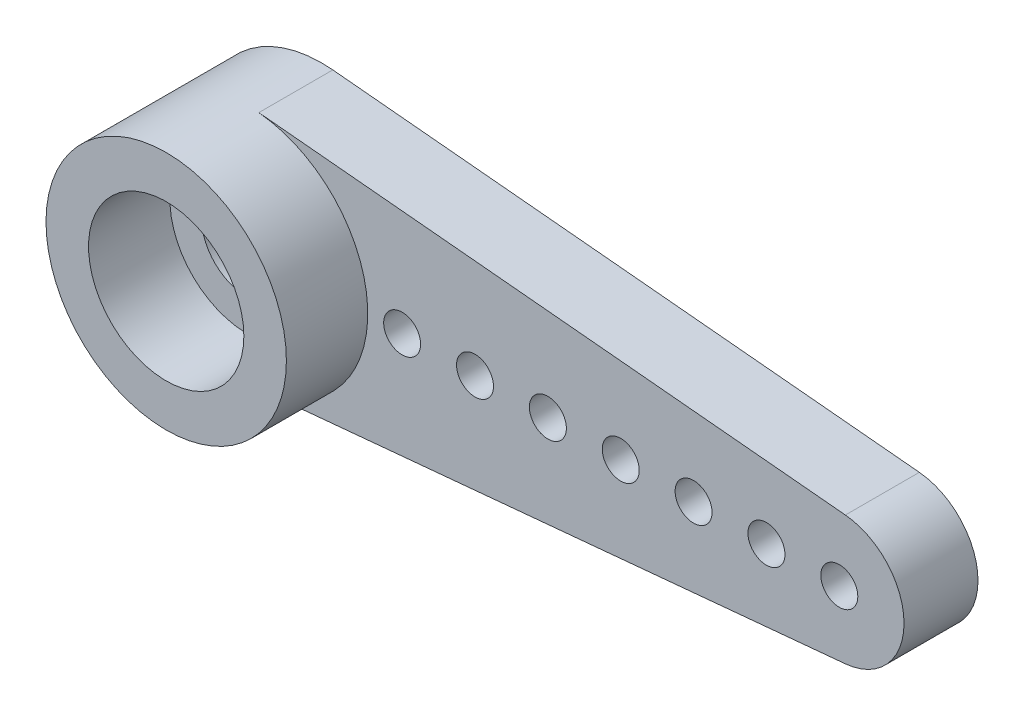
ISO-10303-21;
HEADER;
FILE_DESCRIPTION(('STEP AP214'),'2;1');
FILE_NAME('part.step','',(''),(''),'','','');
FILE_SCHEMA(('AUTOMOTIVE_DESIGN { 1 0 10303 214 1 1 1 1 }'));
ENDSEC;
DATA;
#1=APPLICATION_CONTEXT('core data for automotive mechanical design processes');
#2=APPLICATION_PROTOCOL_DEFINITION('international standard','automotive_design',2000,#1);
#3=PRODUCT_CONTEXT('',#1,'mechanical');
#4=PRODUCT('Part','Part','',(#3));
#5=PRODUCT_RELATED_PRODUCT_CATEGORY('part','',(#4));
#6=PRODUCT_DEFINITION_FORMATION('','',#4);
#7=PRODUCT_DEFINITION_CONTEXT('part definition',#1,'design');
#8=PRODUCT_DEFINITION('design','',#6,#7);
#9=PRODUCT_DEFINITION_SHAPE('','',#8);
#10=(LENGTH_UNIT() NAMED_UNIT(*) SI_UNIT(.MILLI.,.METRE.));
#11=(NAMED_UNIT(*) PLANE_ANGLE_UNIT() SI_UNIT($,.RADIAN.));
#12=(NAMED_UNIT(*) SI_UNIT($,.STERADIAN.) SOLID_ANGLE_UNIT());
#13=UNCERTAINTY_MEASURE_WITH_UNIT(LENGTH_MEASURE(1.E-05),#10,'distance_accuracy_value','');
#14=(GEOMETRIC_REPRESENTATION_CONTEXT(3) GLOBAL_UNCERTAINTY_ASSIGNED_CONTEXT((#13)) GLOBAL_UNIT_ASSIGNED_CONTEXT((#10,
#11,#12)) REPRESENTATION_CONTEXT('',''));
#15=CARTESIAN_POINT('',(0.,0.,0.));
#16=DIRECTION('',(0.,0.,1.));
#17=DIRECTION('',(1.,0.,0.));
#18=AXIS2_PLACEMENT_3D('',#15,#16,#17);
#19=CARTESIAN_POINT('',(16.,0.,2.));
#20=DIRECTION('',(0.,0.,1.));
#21=DIRECTION('',(1.,0.,0.));
#22=AXIS2_PLACEMENT_3D('',#19,#20,#21);
#23=PLANE('',#22);
#24=CARTESIAN_POINT('',(0.,0.,2.));
#25=DIRECTION('',(0.,0.,1.));
#26=DIRECTION('',(1.,0.,0.));
#27=AXIS2_PLACEMENT_3D('',#24,#25,#26);
#28=CIRCLE('',#27,1.25);
#29=CARTESIAN_POINT('',(1.25,0.,2.));
#30=VERTEX_POINT('',#29);
#31=EDGE_CURVE('E118',#30,#30,#28,.T.);
#32=ORIENTED_EDGE('',*,*,#31,.F.);
#33=EDGE_LOOP('',(#32));
#34=FACE_BOUND('',#33,.T.);
#35=CARTESIAN_POINT('',(0.,0.,2.));
#36=DIRECTION('',(0.,0.,1.));
#37=DIRECTION('',(1.,0.,0.));
#38=AXIS2_PLACEMENT_3D('',#35,#36,#37);
#39=CIRCLE('',#38,2.1);
#40=CARTESIAN_POINT('',(2.1,0.,2.));
#41=VERTEX_POINT('',#40);
#42=EDGE_CURVE('E160',#41,#41,#39,.T.);
#43=ORIENTED_EDGE('',*,*,#42,.T.);
#44=EDGE_LOOP('',(#43));
#45=FACE_BOUND('',#44,.T.);
#46=ADVANCED_FACE('F33',(#34,#45),#23,.T.);
#47=CARTESIAN_POINT('',(0.,0.,2.));
#48=DIRECTION('',(0.,0.,1.));
#49=DIRECTION('',(1.,0.,0.));
#50=AXIS2_PLACEMENT_3D('',#47,#48,#49);
#51=CIRCLE('',#50,3.25);
#52=CARTESIAN_POINT('',(0.304687499999997,-3.23568625292128,2.));
#53=VERTEX_POINT('',#52);
#54=CARTESIAN_POINT('',(0.3046875,3.23568625292128,2.));
#55=VERTEX_POINT('',#54);
#56=EDGE_CURVE('E11',#53,#55,#51,.T.);
#57=ORIENTED_EDGE('',*,*,#56,.F.);
#58=DIRECTION('',(0.995595770129625,0.0937499999999999,0.));
#59=VECTOR('',#58,1.);
#60=CARTESIAN_POINT('',(0.3046875,-3.23568625292128,2.));
#61=LINE('',#60,#59);
#62=CARTESIAN_POINT('',(16.1640625,-1.74229259772684,2.));
#63=VERTEX_POINT('',#62);
#64=EDGE_CURVE('E51',#53,#63,#61,.T.);
#65=ORIENTED_EDGE('',*,*,#64,.T.);
#66=CARTESIAN_POINT('',(16.,0.,2.));
#67=DIRECTION('',(0.,0.,1.));
#68=DIRECTION('',(1.,0.,0.));
#69=AXIS2_PLACEMENT_3D('',#66,#67,#68);
#70=CIRCLE('',#69,1.75);
#71=CARTESIAN_POINT('',(16.1640625,1.74229259772684,2.));
#72=VERTEX_POINT('',#71);
#73=EDGE_CURVE('E90',#63,#72,#70,.T.);
#74=ORIENTED_EDGE('',*,*,#73,.T.);
#75=DIRECTION('',(-0.995595770129625,0.09375,0.));
#76=VECTOR('',#75,1.);
#77=CARTESIAN_POINT('',(16.1640625,1.74229259772684,2.));
#78=LINE('',#77,#76);
#79=EDGE_CURVE('E81',#72,#55,#78,.T.);
#80=ORIENTED_EDGE('',*,*,#79,.T.);
#81=EDGE_LOOP('',(#57,#65,#74,#80));
#82=FACE_BOUND('',#81,.T.);
#83=CARTESIAN_POINT('',(6.15,-2.04384822602926E-13,2.));
#84=DIRECTION('',(0.,0.,1.));
#85=DIRECTION('',(1.,0.,0.));
#86=AXIS2_PLACEMENT_3D('',#83,#84,#85);
#87=CIRCLE('',#86,0.499999999999999);
#88=CARTESIAN_POINT('',(6.65,-2.04384822602926E-13,2.));
#89=VERTEX_POINT('',#88);
#90=EDGE_CURVE('E142',#89,#89,#87,.T.);
#91=ORIENTED_EDGE('',*,*,#90,.F.);
#92=EDGE_LOOP('',(#91));
#93=FACE_BOUND('',#92,.T.);
#94=CARTESIAN_POINT('',(10.09,-1.22630893561756E-13,2.));
#95=DIRECTION('',(0.,0.,1.));
#96=DIRECTION('',(1.,0.,0.));
#97=AXIS2_PLACEMENT_3D('',#94,#95,#96);
#98=CIRCLE('',#97,0.499999999999999);
#99=CARTESIAN_POINT('',(10.59,-1.22630893561756E-13,2.));
#100=VERTEX_POINT('',#99);
#101=EDGE_CURVE('E130',#100,#100,#98,.T.);
#102=ORIENTED_EDGE('',*,*,#101,.F.);
#103=EDGE_LOOP('',(#102));
#104=FACE_BOUND('',#103,.T.);
#105=CARTESIAN_POINT('',(16.,0.,2.));
#106=DIRECTION('',(0.,0.,1.));
#107=DIRECTION('',(1.,0.,0.));
#108=AXIS2_PLACEMENT_3D('',#105,#106,#107);
#109=CIRCLE('',#108,0.499999999999999);
#110=CARTESIAN_POINT('',(16.5,0.,2.));
#111=VERTEX_POINT('',#110);
#112=EDGE_CURVE('E105',#111,#111,#109,.T.);
#113=ORIENTED_EDGE('',*,*,#112,.F.);
#114=EDGE_LOOP('',(#113));
#115=FACE_BOUND('',#114,.T.);
#116=CARTESIAN_POINT('',(14.03,0.,2.));
#117=DIRECTION('',(0.,0.,1.));
#118=DIRECTION('',(1.,0.,0.));
#119=AXIS2_PLACEMENT_3D('',#116,#117,#118);
#120=CIRCLE('',#119,0.499999999999999);
#121=CARTESIAN_POINT('',(14.53,0.,2.));
#122=VERTEX_POINT('',#121);
#123=EDGE_CURVE('E112',#122,#122,#120,.T.);
#124=ORIENTED_EDGE('',*,*,#123,.F.);
#125=EDGE_LOOP('',(#124));
#126=FACE_BOUND('',#125,.T.);
#127=CARTESIAN_POINT('',(12.06,0.,2.));
#128=DIRECTION('',(0.,0.,1.));
#129=DIRECTION('',(1.,0.,0.));
#130=AXIS2_PLACEMENT_3D('',#127,#128,#129);
#131=CIRCLE('',#130,0.499999999999999);
#132=CARTESIAN_POINT('',(12.56,0.,2.));
#133=VERTEX_POINT('',#132);
#134=EDGE_CURVE('E124',#133,#133,#131,.T.);
#135=ORIENTED_EDGE('',*,*,#134,.F.);
#136=EDGE_LOOP('',(#135));
#137=FACE_BOUND('',#136,.T.);
#138=CARTESIAN_POINT('',(8.12,-1.63507858082341E-13,2.));
#139=DIRECTION('',(0.,0.,1.));
#140=DIRECTION('',(1.,0.,0.));
#141=AXIS2_PLACEMENT_3D('',#138,#139,#140);
#142=CIRCLE('',#141,0.499999999999999);
#143=CARTESIAN_POINT('',(8.62,-1.63507858082341E-13,2.));
#144=VERTEX_POINT('',#143);
#145=EDGE_CURVE('E136',#144,#144,#142,.T.);
#146=ORIENTED_EDGE('',*,*,#145,.F.);
#147=EDGE_LOOP('',(#146));
#148=FACE_BOUND('',#147,.T.);
#149=CARTESIAN_POINT('',(4.18,-2.45261787123512E-13,2.));
#150=DIRECTION('',(0.,0.,1.));
#151=DIRECTION('',(1.,0.,0.));
#152=AXIS2_PLACEMENT_3D('',#149,#150,#151);
#153=CIRCLE('',#152,0.499999999999999);
#154=CARTESIAN_POINT('',(4.68,-2.45261787123512E-13,2.));
#155=VERTEX_POINT('',#154);
#156=EDGE_CURVE('E148',#155,#155,#153,.T.);
#157=ORIENTED_EDGE('',*,*,#156,.F.);
#158=EDGE_LOOP('',(#157));
#159=FACE_BOUND('',#158,.T.);
#160=ADVANCED_FACE('F87',(#82,#93,#104,#115,#126,#137,#148,#159),#23,.T.);
#161=CARTESIAN_POINT('',(16.,0.,0.));
#162=DIRECTION('',(0.,0.,1.));
#163=DIRECTION('',(1.,0.,0.));
#164=AXIS2_PLACEMENT_3D('',#161,#162,#163);
#165=PLANE('',#164);
#166=CARTESIAN_POINT('',(16.,0.,0.));
#167=DIRECTION('',(0.,0.,1.));
#168=DIRECTION('',(1.,0.,0.));
#169=AXIS2_PLACEMENT_3D('',#166,#167,#168);
#170=CIRCLE('',#169,1.75);
#171=CARTESIAN_POINT('',(16.1640625,-1.74229259772684,0.));
#172=VERTEX_POINT('',#171);
#173=CARTESIAN_POINT('',(16.1640625,1.74229259772684,0.));
#174=VERTEX_POINT('',#173);
#175=EDGE_CURVE('E102',#172,#174,#170,.T.);
#176=ORIENTED_EDGE('',*,*,#175,.F.);
#177=DIRECTION('',(0.995595770129625,0.0937499999999999,0.));
#178=VECTOR('',#177,1.);
#179=CARTESIAN_POINT('',(0.3046875,-3.23568625292128,0.));
#180=LINE('',#179,#178);
#181=CARTESIAN_POINT('',(0.304687499999997,-3.23568625292128,0.));
#182=VERTEX_POINT('',#181);
#183=EDGE_CURVE('E74',#182,#172,#180,.T.);
#184=ORIENTED_EDGE('',*,*,#183,.F.);
#185=CARTESIAN_POINT('',(0.,0.,0.));
#186=DIRECTION('',(0.,0.,1.));
#187=DIRECTION('',(1.,0.,0.));
#188=AXIS2_PLACEMENT_3D('',#185,#186,#187);
#189=CIRCLE('',#188,3.25);
#190=CARTESIAN_POINT('',(0.3046875,3.23568625292128,0.));
#191=VERTEX_POINT('',#190);
#192=EDGE_CURVE('E69',#191,#182,#189,.T.);
#193=ORIENTED_EDGE('',*,*,#192,.F.);
#194=DIRECTION('',(-0.995595770129625,0.09375,0.));
#195=VECTOR('',#194,1.);
#196=CARTESIAN_POINT('',(16.1640625,1.74229259772684,0.));
#197=LINE('',#196,#195);
#198=EDGE_CURVE('E85',#174,#191,#197,.T.);
#199=ORIENTED_EDGE('',*,*,#198,.F.);
#200=EDGE_LOOP('',(#176,#184,#193,#199));
#201=FACE_BOUND('',#200,.T.);
#202=CARTESIAN_POINT('',(16.,0.,0.));
#203=DIRECTION('',(0.,0.,1.));
#204=DIRECTION('',(1.,0.,0.));
#205=AXIS2_PLACEMENT_3D('',#202,#203,#204);
#206=CIRCLE('',#205,0.499999999999999);
#207=CARTESIAN_POINT('',(16.5,0.,0.));
#208=VERTEX_POINT('',#207);
#209=EDGE_CURVE('E109',#208,#208,#206,.T.);
#210=ORIENTED_EDGE('',*,*,#209,.T.);
#211=EDGE_LOOP('',(#210));
#212=FACE_BOUND('',#211,.T.);
#213=CARTESIAN_POINT('',(14.03,0.,0.));
#214=DIRECTION('',(0.,0.,1.));
#215=DIRECTION('',(1.,0.,0.));
#216=AXIS2_PLACEMENT_3D('',#213,#214,#215);
#217=CIRCLE('',#216,0.499999999999999);
#218=CARTESIAN_POINT('',(14.53,0.,0.));
#219=VERTEX_POINT('',#218);
#220=EDGE_CURVE('E115',#219,#219,#217,.T.);
#221=ORIENTED_EDGE('',*,*,#220,.T.);
#222=EDGE_LOOP('',(#221));
#223=FACE_BOUND('',#222,.T.);
#224=CARTESIAN_POINT('',(0.,0.,0.));
#225=DIRECTION('',(0.,0.,1.));
#226=DIRECTION('',(1.,0.,0.));
#227=AXIS2_PLACEMENT_3D('',#224,#225,#226);
#228=CIRCLE('',#227,1.25);
#229=CARTESIAN_POINT('',(1.25,0.,0.));
#230=VERTEX_POINT('',#229);
#231=EDGE_CURVE('E121',#230,#230,#228,.T.);
#232=ORIENTED_EDGE('',*,*,#231,.T.);
#233=EDGE_LOOP('',(#232));
#234=FACE_BOUND('',#233,.T.);
#235=CARTESIAN_POINT('',(12.06,0.,0.));
#236=DIRECTION('',(0.,0.,1.));
#237=DIRECTION('',(1.,0.,0.));
#238=AXIS2_PLACEMENT_3D('',#235,#236,#237);
#239=CIRCLE('',#238,0.499999999999999);
#240=CARTESIAN_POINT('',(12.56,0.,0.));
#241=VERTEX_POINT('',#240);
#242=EDGE_CURVE('E127',#241,#241,#239,.T.);
#243=ORIENTED_EDGE('',*,*,#242,.T.);
#244=EDGE_LOOP('',(#243));
#245=FACE_BOUND('',#244,.T.);
#246=CARTESIAN_POINT('',(10.09,-1.22630893561756E-13,0.));
#247=DIRECTION('',(0.,0.,1.));
#248=DIRECTION('',(1.,0.,0.));
#249=AXIS2_PLACEMENT_3D('',#246,#247,#248);
#250=CIRCLE('',#249,0.499999999999999);
#251=CARTESIAN_POINT('',(10.59,-1.22630893561756E-13,0.));
#252=VERTEX_POINT('',#251);
#253=EDGE_CURVE('E133',#252,#252,#250,.T.);
#254=ORIENTED_EDGE('',*,*,#253,.T.);
#255=EDGE_LOOP('',(#254));
#256=FACE_BOUND('',#255,.T.);
#257=CARTESIAN_POINT('',(8.12,-1.63507858082341E-13,0.));
#258=DIRECTION('',(0.,0.,1.));
#259=DIRECTION('',(1.,0.,0.));
#260=AXIS2_PLACEMENT_3D('',#257,#258,#259);
#261=CIRCLE('',#260,0.499999999999999);
#262=CARTESIAN_POINT('',(8.62,-1.63507858082341E-13,0.));
#263=VERTEX_POINT('',#262);
#264=EDGE_CURVE('E139',#263,#263,#261,.T.);
#265=ORIENTED_EDGE('',*,*,#264,.T.);
#266=EDGE_LOOP('',(#265));
#267=FACE_BOUND('',#266,.T.);
#268=CARTESIAN_POINT('',(6.15,-2.04384822602926E-13,0.));
#269=DIRECTION('',(0.,0.,1.));
#270=DIRECTION('',(1.,0.,0.));
#271=AXIS2_PLACEMENT_3D('',#268,#269,#270);
#272=CIRCLE('',#271,0.499999999999999);
#273=CARTESIAN_POINT('',(6.65,-2.04384822602926E-13,0.));
#274=VERTEX_POINT('',#273);
#275=EDGE_CURVE('E145',#274,#274,#272,.T.);
#276=ORIENTED_EDGE('',*,*,#275,.T.);
#277=EDGE_LOOP('',(#276));
#278=FACE_BOUND('',#277,.T.);
#279=CARTESIAN_POINT('',(4.18,-2.45261787123512E-13,0.));
#280=DIRECTION('',(0.,0.,1.));
#281=DIRECTION('',(1.,0.,0.));
#282=AXIS2_PLACEMENT_3D('',#279,#280,#281);
#283=CIRCLE('',#282,0.499999999999999);
#284=CARTESIAN_POINT('',(4.68,-2.45261787123512E-13,0.));
#285=VERTEX_POINT('',#284);
#286=EDGE_CURVE('E151',#285,#285,#283,.T.);
#287=ORIENTED_EDGE('',*,*,#286,.T.);
#288=EDGE_LOOP('',(#287));
#289=FACE_BOUND('',#288,.T.);
#290=ADVANCED_FACE('F188',(#201,#212,#223,#234,#245,#256,#267,#278,#289),#165,.F.);
#291=CARTESIAN_POINT('',(16.,0.,2.));
#292=DIRECTION('',(0.,0.,-1.));
#293=DIRECTION('',(-1.,0.,0.));
#294=AXIS2_PLACEMENT_3D('',#291,#292,#293);
#295=CYLINDRICAL_SURFACE('',#294,1.75);
#296=ORIENTED_EDGE('',*,*,#175,.T.);
#297=DIRECTION('',(0.,0.,-1.));
#298=VECTOR('',#297,1.);
#299=CARTESIAN_POINT('',(16.1640625,1.74229259772684,2.));
#300=LINE('',#299,#298);
#301=EDGE_CURVE('E37',#72,#174,#300,.T.);
#302=ORIENTED_EDGE('',*,*,#301,.F.);
#303=ORIENTED_EDGE('',*,*,#73,.F.);
#304=DIRECTION('',(0.,0.,-1.));
#305=VECTOR('',#304,1.);
#306=CARTESIAN_POINT('',(16.1640625,-1.74229259772684,2.));
#307=LINE('',#306,#305);
#308=EDGE_CURVE('E95',#63,#172,#307,.T.);
#309=ORIENTED_EDGE('',*,*,#308,.T.);
#310=EDGE_LOOP('',(#296,#302,#303,#309));
#311=FACE_BOUND('',#310,.T.);
#312=ADVANCED_FACE('F35',(#311),#295,.T.);
#313=CARTESIAN_POINT('',(16.1640625,1.74229259772684,2.));
#314=DIRECTION('',(-0.09375,-0.995595770129625,0.));
#315=DIRECTION('',(0.995595770129625,-0.09375,0.));
#316=AXIS2_PLACEMENT_3D('',#313,#314,#315);
#317=PLANE('',#316);
#318=ORIENTED_EDGE('',*,*,#198,.T.);
#319=DIRECTION('',(0.,0.,-1.));
#320=VECTOR('',#319,1.);
#321=CARTESIAN_POINT('',(0.3046875,3.23568625292128,2.));
#322=LINE('',#321,#320);
#323=EDGE_CURVE('E83',#55,#191,#322,.T.);
#324=ORIENTED_EDGE('',*,*,#323,.F.);
#325=ORIENTED_EDGE('',*,*,#79,.F.);
#326=ORIENTED_EDGE('',*,*,#301,.T.);
#327=EDGE_LOOP('',(#318,#324,#325,#326));
#328=FACE_BOUND('',#327,.T.);
#329=ADVANCED_FACE('F84',(#328),#317,.F.);
#330=CARTESIAN_POINT('',(0.,0.,2.));
#331=DIRECTION('',(0.,0.,-1.));
#332=DIRECTION('',(-1.,0.,0.));
#333=AXIS2_PLACEMENT_3D('',#330,#331,#332);
#334=CYLINDRICAL_SURFACE('',#333,3.25);
#335=ORIENTED_EDGE('',*,*,#192,.T.);
#336=DIRECTION('',(0.,0.,-1.));
#337=VECTOR('',#336,1.);
#338=CARTESIAN_POINT('',(0.304687499999997,-3.23568625292128,2.));
#339=LINE('',#338,#337);
#340=EDGE_CURVE('E86',#53,#182,#339,.T.);
#341=ORIENTED_EDGE('',*,*,#340,.F.);
#342=ORIENTED_EDGE('',*,*,#56,.T.);
#343=ORIENTED_EDGE('',*,*,#323,.T.);
#344=EDGE_LOOP('',(#335,#341,#342,#343));
#345=FACE_BOUND('',#344,.T.);
#346=CARTESIAN_POINT('',(0.,0.,4.2));
#347=DIRECTION('',(0.,0.,1.));
#348=DIRECTION('',(1.,0.,0.));
#349=AXIS2_PLACEMENT_3D('',#346,#347,#348);
#350=CIRCLE('',#349,3.25);
#351=CARTESIAN_POINT('',(3.25,0.,4.2));
#352=VERTEX_POINT('',#351);
#353=EDGE_CURVE('E154',#352,#352,#350,.T.);
#354=ORIENTED_EDGE('',*,*,#353,.F.);
#355=EDGE_LOOP('',(#354));
#356=FACE_BOUND('',#355,.T.);
#357=ADVANCED_FACE('F93',(#345,#356),#334,.T.);
#358=CARTESIAN_POINT('',(0.3046875,-3.23568625292128,2.));
#359=DIRECTION('',(-0.0937499999999999,0.995595770129625,0.));
#360=DIRECTION('',(-0.995595770129625,-0.0937499999999999,0.));
#361=AXIS2_PLACEMENT_3D('',#358,#359,#360);
#362=PLANE('',#361);
#363=ORIENTED_EDGE('',*,*,#183,.T.);
#364=ORIENTED_EDGE('',*,*,#308,.F.);
#365=ORIENTED_EDGE('',*,*,#64,.F.);
#366=ORIENTED_EDGE('',*,*,#340,.T.);
#367=EDGE_LOOP('',(#363,#364,#365,#366));
#368=FACE_BOUND('',#367,.T.);
#369=ADVANCED_FACE('F97',(#368),#362,.F.);
#370=CARTESIAN_POINT('',(16.,0.,2.));
#371=DIRECTION('',(0.,0.,-1.));
#372=DIRECTION('',(-1.,0.,0.));
#373=AXIS2_PLACEMENT_3D('',#370,#371,#372);
#374=CYLINDRICAL_SURFACE('',#373,0.499999999999999);
#375=ORIENTED_EDGE('',*,*,#112,.T.);
#376=EDGE_LOOP('',(#375));
#377=FACE_BOUND('',#376,.T.);
#378=ORIENTED_EDGE('',*,*,#209,.F.);
#379=EDGE_LOOP('',(#378));
#380=FACE_BOUND('',#379,.T.);
#381=ADVANCED_FACE('F193',(#377,#380),#374,.F.);
#382=CARTESIAN_POINT('',(14.03,0.,2.));
#383=DIRECTION('',(0.,0.,-1.));
#384=DIRECTION('',(-1.,0.,0.));
#385=AXIS2_PLACEMENT_3D('',#382,#383,#384);
#386=CYLINDRICAL_SURFACE('',#385,0.499999999999999);
#387=ORIENTED_EDGE('',*,*,#123,.T.);
#388=EDGE_LOOP('',(#387));
#389=FACE_BOUND('',#388,.T.);
#390=ORIENTED_EDGE('',*,*,#220,.F.);
#391=EDGE_LOOP('',(#390));
#392=FACE_BOUND('',#391,.T.);
#393=ADVANCED_FACE('F247',(#389,#392),#386,.F.);
#394=CARTESIAN_POINT('',(0.,0.,2.));
#395=DIRECTION('',(0.,0.,-1.));
#396=DIRECTION('',(-1.,0.,0.));
#397=AXIS2_PLACEMENT_3D('',#394,#395,#396);
#398=CYLINDRICAL_SURFACE('',#397,1.25);
#399=ORIENTED_EDGE('',*,*,#31,.T.);
#400=EDGE_LOOP('',(#399));
#401=FACE_BOUND('',#400,.T.);
#402=ORIENTED_EDGE('',*,*,#231,.F.);
#403=EDGE_LOOP('',(#402));
#404=FACE_BOUND('',#403,.T.);
#405=ADVANCED_FACE('F244',(#401,#404),#398,.F.);
#406=CARTESIAN_POINT('',(12.06,0.,2.));
#407=DIRECTION('',(0.,0.,-1.));
#408=DIRECTION('',(-1.,0.,0.));
#409=AXIS2_PLACEMENT_3D('',#406,#407,#408);
#410=CYLINDRICAL_SURFACE('',#409,0.499999999999999);
#411=ORIENTED_EDGE('',*,*,#134,.T.);
#412=EDGE_LOOP('',(#411));
#413=FACE_BOUND('',#412,.T.);
#414=ORIENTED_EDGE('',*,*,#242,.F.);
#415=EDGE_LOOP('',(#414));
#416=FACE_BOUND('',#415,.T.);
#417=ADVANCED_FACE('F240',(#413,#416),#410,.F.);
#418=CARTESIAN_POINT('',(10.09,-1.22630893561756E-13,2.));
#419=DIRECTION('',(0.,0.,-1.));
#420=DIRECTION('',(-1.,0.,0.));
#421=AXIS2_PLACEMENT_3D('',#418,#419,#420);
#422=CYLINDRICAL_SURFACE('',#421,0.499999999999999);
#423=ORIENTED_EDGE('',*,*,#101,.T.);
#424=EDGE_LOOP('',(#423));
#425=FACE_BOUND('',#424,.T.);
#426=ORIENTED_EDGE('',*,*,#253,.F.);
#427=EDGE_LOOP('',(#426));
#428=FACE_BOUND('',#427,.T.);
#429=ADVANCED_FACE('F234',(#425,#428),#422,.F.);
#430=CARTESIAN_POINT('',(8.12,-1.63507858082341E-13,2.));
#431=DIRECTION('',(0.,0.,-1.));
#432=DIRECTION('',(-1.,0.,0.));
#433=AXIS2_PLACEMENT_3D('',#430,#431,#432);
#434=CYLINDRICAL_SURFACE('',#433,0.499999999999999);
#435=ORIENTED_EDGE('',*,*,#145,.T.);
#436=EDGE_LOOP('',(#435));
#437=FACE_BOUND('',#436,.T.);
#438=ORIENTED_EDGE('',*,*,#264,.F.);
#439=EDGE_LOOP('',(#438));
#440=FACE_BOUND('',#439,.T.);
#441=ADVANCED_FACE('F228',(#437,#440),#434,.F.);
#442=CARTESIAN_POINT('',(6.15,-2.04384822602926E-13,2.));
#443=DIRECTION('',(0.,0.,-1.));
#444=DIRECTION('',(-1.,0.,0.));
#445=AXIS2_PLACEMENT_3D('',#442,#443,#444);
#446=CYLINDRICAL_SURFACE('',#445,0.499999999999999);
#447=ORIENTED_EDGE('',*,*,#90,.T.);
#448=EDGE_LOOP('',(#447));
#449=FACE_BOUND('',#448,.T.);
#450=ORIENTED_EDGE('',*,*,#275,.F.);
#451=EDGE_LOOP('',(#450));
#452=FACE_BOUND('',#451,.T.);
#453=ADVANCED_FACE('F179',(#449,#452),#446,.F.);
#454=CARTESIAN_POINT('',(4.18,-2.45261787123512E-13,2.));
#455=DIRECTION('',(0.,0.,-1.));
#456=DIRECTION('',(-1.,0.,0.));
#457=AXIS2_PLACEMENT_3D('',#454,#455,#456);
#458=CYLINDRICAL_SURFACE('',#457,0.499999999999999);
#459=ORIENTED_EDGE('',*,*,#156,.T.);
#460=EDGE_LOOP('',(#459));
#461=FACE_BOUND('',#460,.T.);
#462=ORIENTED_EDGE('',*,*,#286,.F.);
#463=EDGE_LOOP('',(#462));
#464=FACE_BOUND('',#463,.T.);
#465=ADVANCED_FACE('F171',(#461,#464),#458,.F.);
#466=CARTESIAN_POINT('',(0.,0.,4.2));
#467=DIRECTION('',(0.,0.,1.));
#468=DIRECTION('',(1.,0.,0.));
#469=AXIS2_PLACEMENT_3D('',#466,#467,#468);
#470=PLANE('',#469);
#471=ORIENTED_EDGE('',*,*,#353,.T.);
#472=EDGE_LOOP('',(#471));
#473=FACE_BOUND('',#472,.T.);
#474=CARTESIAN_POINT('',(0.,0.,4.2));
#475=DIRECTION('',(0.,0.,1.));
#476=DIRECTION('',(1.,0.,0.));
#477=AXIS2_PLACEMENT_3D('',#474,#475,#476);
#478=CIRCLE('',#477,2.1);
#479=CARTESIAN_POINT('',(2.1,0.,4.2));
#480=VERTEX_POINT('',#479);
#481=EDGE_CURVE('E159',#480,#480,#478,.T.);
#482=ORIENTED_EDGE('',*,*,#481,.F.);
#483=EDGE_LOOP('',(#482));
#484=FACE_BOUND('',#483,.T.);
#485=ADVANCED_FACE('F169',(#473,#484),#470,.T.);
#486=CARTESIAN_POINT('',(0.,0.,4.2));
#487=DIRECTION('',(0.,0.,-1.));
#488=DIRECTION('',(-1.,0.,0.));
#489=AXIS2_PLACEMENT_3D('',#486,#487,#488);
#490=CYLINDRICAL_SURFACE('',#489,2.1);
#491=ORIENTED_EDGE('',*,*,#481,.T.);
#492=EDGE_LOOP('',(#491));
#493=FACE_BOUND('',#492,.T.);
#494=ORIENTED_EDGE('',*,*,#42,.F.);
#495=EDGE_LOOP('',(#494));
#496=FACE_BOUND('',#495,.T.);
#497=ADVANCED_FACE('F166',(#493,#496),#490,.F.);
#498=CLOSED_SHELL('',(#46,#160,#290,#312,#329,#357,#369,#381,#393,#405,#417,#429,#441,#453,#465,
#485,#497));
#499=MANIFOLD_SOLID_BREP('B2',#498);
#500=ADVANCED_BREP_SHAPE_REPRESENTATION('',(#18,#499),#14);
#501=SHAPE_DEFINITION_REPRESENTATION(#9,#500);
ENDSEC;
END-ISO-10303-21;
